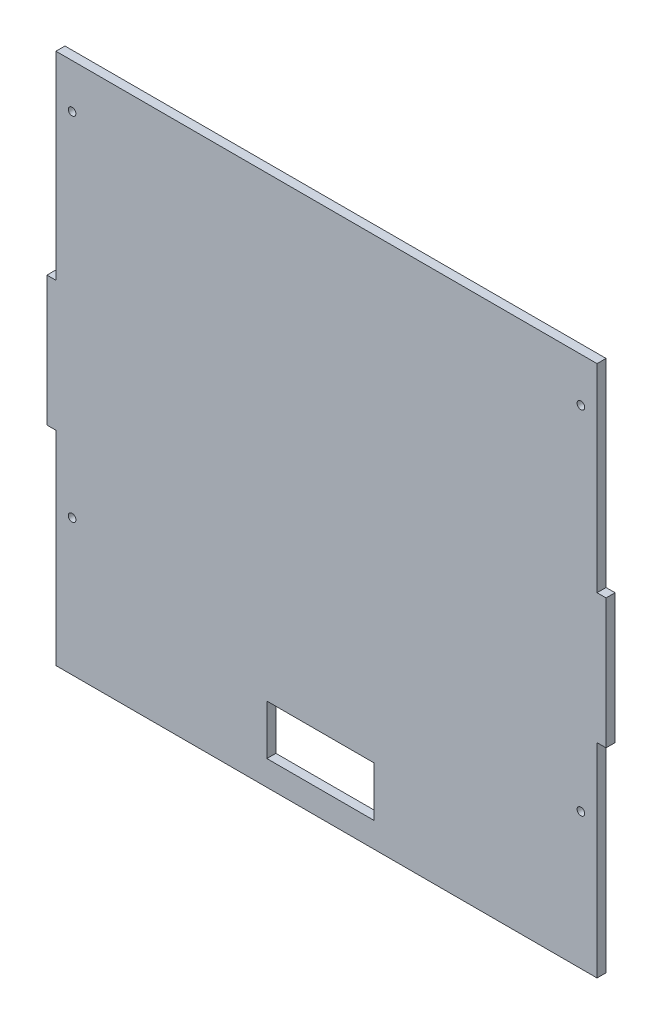
ISO-10303-21;
HEADER;
FILE_DESCRIPTION(('STEP AP214'),'2;1');
FILE_NAME('part.step','',(''),(''),'','','');
FILE_SCHEMA(('AUTOMOTIVE_DESIGN { 1 0 10303 214 1 1 1 1 }'));
ENDSEC;
DATA;
#1=APPLICATION_CONTEXT('core data for automotive mechanical design processes');
#2=APPLICATION_PROTOCOL_DEFINITION('international standard','automotive_design',2000,#1);
#3=PRODUCT_CONTEXT('',#1,'mechanical');
#4=PRODUCT('Part','Part','',(#3));
#5=PRODUCT_RELATED_PRODUCT_CATEGORY('part','',(#4));
#6=PRODUCT_DEFINITION_FORMATION('','',#4);
#7=PRODUCT_DEFINITION_CONTEXT('part definition',#1,'design');
#8=PRODUCT_DEFINITION('design','',#6,#7);
#9=PRODUCT_DEFINITION_SHAPE('','',#8);
#10=(LENGTH_UNIT() NAMED_UNIT(*) SI_UNIT(.MILLI.,.METRE.));
#11=(NAMED_UNIT(*) PLANE_ANGLE_UNIT() SI_UNIT($,.RADIAN.));
#12=(NAMED_UNIT(*) SI_UNIT($,.STERADIAN.) SOLID_ANGLE_UNIT());
#13=UNCERTAINTY_MEASURE_WITH_UNIT(LENGTH_MEASURE(1.E-05),#10,'distance_accuracy_value','');
#14=(GEOMETRIC_REPRESENTATION_CONTEXT(3) GLOBAL_UNCERTAINTY_ASSIGNED_CONTEXT((#13)) GLOBAL_UNIT_ASSIGNED_CONTEXT((#10,
#11,#12)) REPRESENTATION_CONTEXT('',''));
#15=CARTESIAN_POINT('',(0.,0.,0.));
#16=DIRECTION('',(0.,0.,1.));
#17=DIRECTION('',(1.,0.,0.));
#18=AXIS2_PLACEMENT_3D('',#15,#16,#17);
#19=CARTESIAN_POINT('',(-300.,0.,5.));
#20=DIRECTION('',(1.,0.,0.));
#21=DIRECTION('',(0.,0.,-1.));
#22=AXIS2_PLACEMENT_3D('',#19,#20,#21);
#23=PLANE('',#22);
#24=DIRECTION('',(0.,-1.,0.));
#25=VECTOR('',#24,1.);
#26=CARTESIAN_POINT('',(-300.,0.,0.));
#27=LINE('',#26,#25);
#28=CARTESIAN_POINT('',(-300.,0.,0.));
#29=VERTEX_POINT('',#28);
#30=CARTESIAN_POINT('',(-300.,-110.,0.));
#31=VERTEX_POINT('',#30);
#32=EDGE_CURVE('E330',#29,#31,#27,.T.);
#33=ORIENTED_EDGE('',*,*,#32,.T.);
#34=CARTESIAN_POINT('',(-300.,-110.,0.));
#35=CARTESIAN_POINT('',(-300.,-110.,5.));
#36=B_SPLINE_CURVE_WITH_KNOTS('',1,(#34,#35),.UNSPECIFIED.,.F.,.F.,(2,2),(0.,
0.0324675324675325),.UNSPECIFIED.);
#37=CARTESIAN_POINT('',(-300.,-110.,5.));
#38=VERTEX_POINT('',#37);
#39=EDGE_CURVE('E239',#31,#38,#36,.T.);
#40=ORIENTED_EDGE('',*,*,#39,.T.);
#41=DIRECTION('',(0.,-1.,0.));
#42=VECTOR('',#41,1.);
#43=CARTESIAN_POINT('',(-300.,0.,5.));
#44=LINE('',#43,#42);
#45=CARTESIAN_POINT('',(-300.,0.,5.));
#46=VERTEX_POINT('',#45);
#47=EDGE_CURVE('E319',#46,#38,#44,.T.);
#48=ORIENTED_EDGE('',*,*,#47,.F.);
#49=DIRECTION('',(0.,0.,-1.));
#50=VECTOR('',#49,1.);
#51=CARTESIAN_POINT('',(-300.,0.,5.));
#52=LINE('',#51,#50);
#53=EDGE_CURVE('E97',#46,#29,#52,.T.);
#54=ORIENTED_EDGE('',*,*,#53,.T.);
#55=EDGE_LOOP('',(#33,#40,#48,#54));
#56=FACE_BOUND('',#55,.T.);
#57=ADVANCED_FACE('F89',(#56),#23,.F.);
#58=CARTESIAN_POINT('',(0.,0.,5.));
#59=DIRECTION('',(-1.,0.,0.));
#60=DIRECTION('',(0.,-1.,0.));
#61=AXIS2_PLACEMENT_3D('',#58,#59,#60);
#62=PLANE('',#61);
#63=CARTESIAN_POINT('',(0.,-110.,0.));
#64=CARTESIAN_POINT('',(0.,-110.,5.));
#65=B_SPLINE_CURVE_WITH_KNOTS('',1,(#63,#64),.UNSPECIFIED.,.F.,.F.,(2,2),(0.,
0.0324675324675325),.UNSPECIFIED.);
#66=CARTESIAN_POINT('',(0.,-110.,0.));
#67=VERTEX_POINT('',#66);
#68=CARTESIAN_POINT('',(0.,-110.,5.));
#69=VERTEX_POINT('',#68);
#70=EDGE_CURVE('E279',#67,#69,#65,.T.);
#71=ORIENTED_EDGE('',*,*,#70,.F.);
#72=DIRECTION('',(0.,1.,0.));
#73=VECTOR('',#72,1.);
#74=CARTESIAN_POINT('',(0.,0.,0.));
#75=LINE('',#74,#73);
#76=CARTESIAN_POINT('',(0.,0.,0.));
#77=VERTEX_POINT('',#76);
#78=EDGE_CURVE('E294',#67,#77,#75,.T.);
#79=ORIENTED_EDGE('',*,*,#78,.T.);
#80=DIRECTION('',(0.,0.,-1.));
#81=VECTOR('',#80,1.);
#82=CARTESIAN_POINT('',(0.,0.,5.));
#83=LINE('',#82,#81);
#84=CARTESIAN_POINT('',(0.,0.,5.));
#85=VERTEX_POINT('',#84);
#86=EDGE_CURVE('E13',#85,#77,#83,.T.);
#87=ORIENTED_EDGE('',*,*,#86,.F.);
#88=DIRECTION('',(0.,1.,0.));
#89=VECTOR('',#88,1.);
#90=CARTESIAN_POINT('',(0.,0.,5.));
#91=LINE('',#90,#89);
#92=EDGE_CURVE('E316',#69,#85,#91,.T.);
#93=ORIENTED_EDGE('',*,*,#92,.F.);
#94=EDGE_LOOP('',(#71,#79,#87,#93));
#95=FACE_BOUND('',#94,.T.);
#96=ADVANCED_FACE('F91',(#95),#62,.F.);
#97=CARTESIAN_POINT('',(0.,-182.,5.));
#98=CARTESIAN_POINT('',(0.,-182.,0.));
#99=B_SPLINE_CURVE_WITH_KNOTS('',1,(#97,#98),.UNSPECIFIED.,.F.,.F.,(2,2),(0.5,
0.532467532467532),.UNSPECIFIED.);
#100=CARTESIAN_POINT('',(0.,-182.,5.));
#101=VERTEX_POINT('',#100);
#102=CARTESIAN_POINT('',(0.,-182.,0.));
#103=VERTEX_POINT('',#102);
#104=EDGE_CURVE('E272',#101,#103,#99,.T.);
#105=ORIENTED_EDGE('',*,*,#104,.F.);
#106=CARTESIAN_POINT('',(0.,-295.,5.));
#107=VERTEX_POINT('',#106);
#108=EDGE_CURVE('E312',#107,#101,#91,.T.);
#109=ORIENTED_EDGE('',*,*,#108,.F.);
#110=DIRECTION('',(0.,0.,-1.));
#111=VECTOR('',#110,1.);
#112=CARTESIAN_POINT('',(0.,-295.,5.));
#113=LINE('',#112,#111);
#114=CARTESIAN_POINT('',(0.,-295.,0.));
#115=VERTEX_POINT('',#114);
#116=EDGE_CURVE('E324',#107,#115,#113,.T.);
#117=ORIENTED_EDGE('',*,*,#116,.T.);
#118=EDGE_CURVE('E325',#115,#103,#75,.T.);
#119=ORIENTED_EDGE('',*,*,#118,.T.);
#120=EDGE_LOOP('',(#105,#109,#117,#119));
#121=FACE_BOUND('',#120,.T.);
#122=ADVANCED_FACE('F376',(#121),#62,.F.);
#123=CARTESIAN_POINT('',(0.,0.,5.));
#124=DIRECTION('',(0.,-1.,0.));
#125=DIRECTION('',(0.,0.,-1.));
#126=AXIS2_PLACEMENT_3D('',#123,#124,#125);
#127=PLANE('',#126);
#128=DIRECTION('',(-1.,0.,0.));
#129=VECTOR('',#128,1.);
#130=CARTESIAN_POINT('',(0.,0.,0.));
#131=LINE('',#130,#129);
#132=EDGE_CURVE('E327',#77,#29,#131,.T.);
#133=ORIENTED_EDGE('',*,*,#132,.T.);
#134=ORIENTED_EDGE('',*,*,#53,.F.);
#135=DIRECTION('',(-1.,0.,0.));
#136=VECTOR('',#135,1.);
#137=CARTESIAN_POINT('',(0.,0.,5.));
#138=LINE('',#137,#136);
#139=EDGE_CURVE('E315',#85,#46,#138,.T.);
#140=ORIENTED_EDGE('',*,*,#139,.F.);
#141=ORIENTED_EDGE('',*,*,#86,.T.);
#142=EDGE_LOOP('',(#133,#134,#140,#141));
#143=FACE_BOUND('',#142,.T.);
#144=ADVANCED_FACE('F361',(#143),#127,.F.);
#145=CARTESIAN_POINT('',(-300.,-182.,5.));
#146=VERTEX_POINT('',#145);
#147=CARTESIAN_POINT('',(-300.,-295.,5.));
#148=VERTEX_POINT('',#147);
#149=EDGE_CURVE('E318',#146,#148,#44,.T.);
#150=ORIENTED_EDGE('',*,*,#149,.F.);
#151=CARTESIAN_POINT('',(-300.,-182.,5.));
#152=CARTESIAN_POINT('',(-300.,-182.,0.));
#153=B_SPLINE_CURVE_WITH_KNOTS('',1,(#151,#152),.UNSPECIFIED.,.F.,.F.,(2,2),(0.5,
0.532467532467532),.UNSPECIFIED.);
#154=CARTESIAN_POINT('',(-300.,-182.,0.));
#155=VERTEX_POINT('',#154);
#156=EDGE_CURVE('E252',#146,#155,#153,.T.);
#157=ORIENTED_EDGE('',*,*,#156,.T.);
#158=CARTESIAN_POINT('',(-300.,-295.,0.));
#159=VERTEX_POINT('',#158);
#160=EDGE_CURVE('E329',#155,#159,#27,.T.);
#161=ORIENTED_EDGE('',*,*,#160,.T.);
#162=DIRECTION('',(0.,0.,-1.));
#163=VECTOR('',#162,1.);
#164=CARTESIAN_POINT('',(-300.,-295.,5.));
#165=LINE('',#164,#163);
#166=EDGE_CURVE('E337',#148,#159,#165,.T.);
#167=ORIENTED_EDGE('',*,*,#166,.F.);
#168=EDGE_LOOP('',(#150,#157,#161,#167));
#169=FACE_BOUND('',#168,.T.);
#170=ADVANCED_FACE('F385',(#169),#23,.F.);
#171=CARTESIAN_POINT('',(0.,-295.,5.));
#172=DIRECTION('',(0.,1.,0.));
#173=DIRECTION('',(-1.,0.,0.));
#174=AXIS2_PLACEMENT_3D('',#171,#172,#173);
#175=PLANE('',#174);
#176=DIRECTION('',(1.,0.,0.));
#177=VECTOR('',#176,1.);
#178=CARTESIAN_POINT('',(0.,-295.,0.));
#179=LINE('',#178,#177);
#180=EDGE_CURVE('E333',#159,#115,#179,.T.);
#181=ORIENTED_EDGE('',*,*,#180,.T.);
#182=ORIENTED_EDGE('',*,*,#116,.F.);
#183=DIRECTION('',(1.,0.,0.));
#184=VECTOR('',#183,1.);
#185=CARTESIAN_POINT('',(0.,-295.,5.));
#186=LINE('',#185,#184);
#187=EDGE_CURVE('E322',#148,#107,#186,.T.);
#188=ORIENTED_EDGE('',*,*,#187,.F.);
#189=ORIENTED_EDGE('',*,*,#166,.T.);
#190=EDGE_LOOP('',(#181,#182,#188,#189));
#191=FACE_BOUND('',#190,.T.);
#192=ADVANCED_FACE('F382',(#191),#175,.F.);
#193=CARTESIAN_POINT('',(0.,0.,5.));
#194=DIRECTION('',(0.,0.,-1.));
#195=DIRECTION('',(-1.,0.,0.));
#196=AXIS2_PLACEMENT_3D('',#193,#194,#195);
#197=PLANE('',#196);
#198=CARTESIAN_POINT('',(-8.94895975051008,-24.5028370437762,5.));
#199=DIRECTION('',(0.,0.,-1.));
#200=DIRECTION('',(1.,0.,0.));
#201=AXIS2_PLACEMENT_3D('',#198,#199,#200);
#202=CIRCLE('',#201,2.09999999999182);
#203=CARTESIAN_POINT('',(-6.84895975051825,-24.5028370437762,5.));
#204=VERTEX_POINT('',#203);
#205=EDGE_CURVE('E566',#204,#204,#202,.T.);
#206=ORIENTED_EDGE('',*,*,#205,.T.);
#207=EDGE_LOOP('',(#206));
#208=FACE_BOUND('',#207,.T.);
#209=CARTESIAN_POINT('',(-291.05104024949,-24.5028370437762,5.));
#210=DIRECTION('',(0.,0.,-1.));
#211=DIRECTION('',(-1.,0.,0.));
#212=AXIS2_PLACEMENT_3D('',#209,#210,#211);
#213=CIRCLE('',#212,2.09999999999182);
#214=CARTESIAN_POINT('',(-293.151040249482,-24.5028370437762,5.));
#215=VERTEX_POINT('',#214);
#216=EDGE_CURVE('E574',#215,#215,#213,.T.);
#217=ORIENTED_EDGE('',*,*,#216,.T.);
#218=EDGE_LOOP('',(#217));
#219=FACE_BOUND('',#218,.T.);
#220=CARTESIAN_POINT('',(-291.051040249489,-219.502837043776,5.));
#221=DIRECTION('',(0.,0.,-1.));
#222=DIRECTION('',(-1.,0.,0.));
#223=AXIS2_PLACEMENT_3D('',#220,#221,#222);
#224=CIRCLE('',#223,2.10000000055005);
#225=CARTESIAN_POINT('',(-293.151040250039,-219.502837043776,5.));
#226=VERTEX_POINT('',#225);
#227=EDGE_CURVE('E580',#226,#226,#224,.T.);
#228=ORIENTED_EDGE('',*,*,#227,.T.);
#229=EDGE_LOOP('',(#228));
#230=FACE_BOUND('',#229,.T.);
#231=CARTESIAN_POINT('',(-8.94895975051069,-219.502837043776,5.));
#232=DIRECTION('',(0.,0.,-1.));
#233=DIRECTION('',(1.,0.,0.));
#234=AXIS2_PLACEMENT_3D('',#231,#232,#233);
#235=CIRCLE('',#234,2.10000000055011);
#236=CARTESIAN_POINT('',(-6.84895974996057,-219.502837043776,5.));
#237=VERTEX_POINT('',#236);
#238=EDGE_CURVE('E586',#237,#237,#235,.T.);
#239=ORIENTED_EDGE('',*,*,#238,.T.);
#240=EDGE_LOOP('',(#239));
#241=FACE_BOUND('',#240,.T.);
#242=DIRECTION('',(1.,0.,0.));
#243=VECTOR('',#242,1.);
#244=CARTESIAN_POINT('',(0.,-253.546669542968,5.));
#245=LINE('',#244,#243);
#246=CARTESIAN_POINT('',(-183.05126017735,-253.546669542968,5.));
#247=VERTEX_POINT('',#246);
#248=CARTESIAN_POINT('',(-123.642665934518,-253.546669542968,5.));
#249=VERTEX_POINT('',#248);
#250=EDGE_CURVE('E233',#247,#249,#245,.T.);
#251=ORIENTED_EDGE('',*,*,#250,.T.);
#252=DIRECTION('',(0.,-1.,0.));
#253=VECTOR('',#252,1.);
#254=CARTESIAN_POINT('',(-123.642665934518,0.,5.));
#255=LINE('',#254,#253);
#256=CARTESIAN_POINT('',(-123.642665934518,-281.159114754425,5.));
#257=VERTEX_POINT('',#256);
#258=EDGE_CURVE('E236',#249,#257,#255,.T.);
#259=ORIENTED_EDGE('',*,*,#258,.T.);
#260=DIRECTION('',(-1.,0.,0.));
#261=VECTOR('',#260,1.);
#262=CARTESIAN_POINT('',(0.,-281.159114754425,5.));
#263=LINE('',#262,#261);
#264=CARTESIAN_POINT('',(-183.05126017735,-281.159114754425,5.));
#265=VERTEX_POINT('',#264);
#266=EDGE_CURVE('E228',#257,#265,#263,.T.);
#267=ORIENTED_EDGE('',*,*,#266,.T.);
#268=DIRECTION('',(0.,1.,0.));
#269=VECTOR('',#268,1.);
#270=CARTESIAN_POINT('',(-183.05126017735,0.,5.));
#271=LINE('',#270,#269);
#272=EDGE_CURVE('E208',#265,#247,#271,.T.);
#273=ORIENTED_EDGE('',*,*,#272,.T.);
#274=EDGE_LOOP('',(#251,#259,#267,#273));
#275=FACE_BOUND('',#274,.T.);
#276=ORIENTED_EDGE('',*,*,#108,.T.);
#277=DIRECTION('',(-1.,0.,0.));
#278=VECTOR('',#277,1.);
#279=CARTESIAN_POINT('',(9.99999999954891,-182.,5.));
#280=LINE('',#279,#278);
#281=CARTESIAN_POINT('',(4.99999999999999,-182.,5.));
#282=VERTEX_POINT('',#281);
#283=EDGE_CURVE('E278',#282,#101,#280,.T.);
#284=ORIENTED_EDGE('',*,*,#283,.F.);
#285=DIRECTION('',(0.,-1.,0.));
#286=VECTOR('',#285,1.);
#287=CARTESIAN_POINT('',(4.99999999999998,-110.,5.));
#288=LINE('',#287,#286);
#289=CARTESIAN_POINT('',(4.99999999999998,-110.,5.));
#290=VERTEX_POINT('',#289);
#291=EDGE_CURVE('E295',#290,#282,#288,.T.);
#292=ORIENTED_EDGE('',*,*,#291,.F.);
#293=DIRECTION('',(-1.,0.,0.));
#294=VECTOR('',#293,1.);
#295=CARTESIAN_POINT('',(9.99999999954891,-110.,5.));
#296=LINE('',#295,#294);
#297=EDGE_CURVE('E287',#290,#69,#296,.T.);
#298=ORIENTED_EDGE('',*,*,#297,.T.);
#299=ORIENTED_EDGE('',*,*,#92,.T.);
#300=ORIENTED_EDGE('',*,*,#139,.T.);
#301=ORIENTED_EDGE('',*,*,#47,.T.);
#302=DIRECTION('',(1.,0.,0.));
#303=VECTOR('',#302,1.);
#304=CARTESIAN_POINT('',(-310.000000000001,-110.,5.));
#305=LINE('',#304,#303);
#306=CARTESIAN_POINT('',(-305.000000000001,-110.,5.));
#307=VERTEX_POINT('',#306);
#308=EDGE_CURVE('E260',#307,#38,#305,.T.);
#309=ORIENTED_EDGE('',*,*,#308,.F.);
#310=DIRECTION('',(0.,1.,0.));
#311=VECTOR('',#310,1.);
#312=CARTESIAN_POINT('',(-305.000000000001,-110.,5.));
#313=LINE('',#312,#311);
#314=CARTESIAN_POINT('',(-305.000000000001,-182.,5.));
#315=VERTEX_POINT('',#314);
#316=EDGE_CURVE('E247',#315,#307,#313,.T.);
#317=ORIENTED_EDGE('',*,*,#316,.F.);
#318=DIRECTION('',(1.,0.,0.));
#319=VECTOR('',#318,1.);
#320=CARTESIAN_POINT('',(-310.000000000001,-182.,5.));
#321=LINE('',#320,#319);
#322=EDGE_CURVE('E267',#315,#146,#321,.T.);
#323=ORIENTED_EDGE('',*,*,#322,.T.);
#324=ORIENTED_EDGE('',*,*,#149,.T.);
#325=ORIENTED_EDGE('',*,*,#187,.T.);
#326=EDGE_LOOP('',(#276,#284,#292,#298,#299,#300,#301,#309,#317,#323,#324,#325));
#327=FACE_BOUND('',#326,.T.);
#328=ADVANCED_FACE('F358',(#208,#219,#230,#241,#275,#327),#197,.F.);
#329=CARTESIAN_POINT('',(0.,0.,0.));
#330=DIRECTION('',(0.,0.,-1.));
#331=DIRECTION('',(-1.,0.,0.));
#332=AXIS2_PLACEMENT_3D('',#329,#330,#331);
#333=PLANE('',#332);
#334=CARTESIAN_POINT('',(-8.94895975051008,-24.5028370437762,0.));
#335=DIRECTION('',(0.,0.,-1.));
#336=DIRECTION('',(1.,0.,0.));
#337=AXIS2_PLACEMENT_3D('',#334,#335,#336);
#338=CIRCLE('',#337,2.09999999999182);
#339=CARTESIAN_POINT('',(-6.84895975051825,-24.5028370437762,0.));
#340=VERTEX_POINT('',#339);
#341=EDGE_CURVE('E569',#340,#340,#338,.T.);
#342=ORIENTED_EDGE('',*,*,#341,.F.);
#343=EDGE_LOOP('',(#342));
#344=FACE_BOUND('',#343,.T.);
#345=CARTESIAN_POINT('',(-291.05104024949,-24.5028370437762,0.));
#346=DIRECTION('',(0.,0.,-1.));
#347=DIRECTION('',(-1.,0.,0.));
#348=AXIS2_PLACEMENT_3D('',#345,#346,#347);
#349=CIRCLE('',#348,2.09999999999182);
#350=CARTESIAN_POINT('',(-293.151040249482,-24.5028370437762,0.));
#351=VERTEX_POINT('',#350);
#352=EDGE_CURVE('E571',#351,#351,#349,.T.);
#353=ORIENTED_EDGE('',*,*,#352,.F.);
#354=EDGE_LOOP('',(#353));
#355=FACE_BOUND('',#354,.T.);
#356=CARTESIAN_POINT('',(-291.051040249489,-219.502837043776,0.));
#357=DIRECTION('',(0.,0.,-1.));
#358=DIRECTION('',(-1.,0.,0.));
#359=AXIS2_PLACEMENT_3D('',#356,#357,#358);
#360=CIRCLE('',#359,2.10000000055005);
#361=CARTESIAN_POINT('',(-293.151040250039,-219.502837043776,0.));
#362=VERTEX_POINT('',#361);
#363=EDGE_CURVE('E583',#362,#362,#360,.T.);
#364=ORIENTED_EDGE('',*,*,#363,.F.);
#365=EDGE_LOOP('',(#364));
#366=FACE_BOUND('',#365,.T.);
#367=CARTESIAN_POINT('',(-8.94895975051069,-219.502837043776,0.));
#368=DIRECTION('',(0.,0.,-1.));
#369=DIRECTION('',(1.,0.,0.));
#370=AXIS2_PLACEMENT_3D('',#367,#368,#369);
#371=CIRCLE('',#370,2.10000000055011);
#372=CARTESIAN_POINT('',(-6.84895974996057,-219.502837043776,0.));
#373=VERTEX_POINT('',#372);
#374=EDGE_CURVE('E577',#373,#373,#371,.T.);
#375=ORIENTED_EDGE('',*,*,#374,.F.);
#376=EDGE_LOOP('',(#375));
#377=FACE_BOUND('',#376,.T.);
#378=DIRECTION('',(0.,-1.,0.));
#379=VECTOR('',#378,1.);
#380=CARTESIAN_POINT('',(-123.642665934518,-281.159114754425,0.));
#381=LINE('',#380,#379);
#382=CARTESIAN_POINT('',(-123.642665934518,-253.546669542968,0.));
#383=VERTEX_POINT('',#382);
#384=CARTESIAN_POINT('',(-123.642665934518,-281.159114754425,0.));
#385=VERTEX_POINT('',#384);
#386=EDGE_CURVE('E112',#383,#385,#381,.T.);
#387=ORIENTED_EDGE('',*,*,#386,.F.);
#388=DIRECTION('',(1.,0.,0.));
#389=VECTOR('',#388,1.);
#390=CARTESIAN_POINT('',(-123.642665934518,-253.546669542968,0.));
#391=LINE('',#390,#389);
#392=CARTESIAN_POINT('',(-183.05126017735,-253.546669542968,0.));
#393=VERTEX_POINT('',#392);
#394=EDGE_CURVE('E221',#393,#383,#391,.T.);
#395=ORIENTED_EDGE('',*,*,#394,.F.);
#396=DIRECTION('',(0.,1.,0.));
#397=VECTOR('',#396,1.);
#398=CARTESIAN_POINT('',(-183.05126017735,-281.159114754425,0.));
#399=LINE('',#398,#397);
#400=CARTESIAN_POINT('',(-183.05126017735,-281.159114754425,0.));
#401=VERTEX_POINT('',#400);
#402=EDGE_CURVE('E205',#401,#393,#399,.T.);
#403=ORIENTED_EDGE('',*,*,#402,.F.);
#404=DIRECTION('',(-1.,0.,0.));
#405=VECTOR('',#404,1.);
#406=CARTESIAN_POINT('',(-123.642665934518,-281.159114754425,0.));
#407=LINE('',#406,#405);
#408=EDGE_CURVE('E214',#385,#401,#407,.T.);
#409=ORIENTED_EDGE('',*,*,#408,.F.);
#410=EDGE_LOOP('',(#387,#395,#403,#409));
#411=FACE_BOUND('',#410,.T.);
#412=ORIENTED_EDGE('',*,*,#118,.F.);
#413=ORIENTED_EDGE('',*,*,#180,.F.);
#414=ORIENTED_EDGE('',*,*,#160,.F.);
#415=DIRECTION('',(1.,0.,0.));
#416=VECTOR('',#415,1.);
#417=CARTESIAN_POINT('',(-310.000000000001,-182.,0.));
#418=LINE('',#417,#416);
#419=CARTESIAN_POINT('',(-305.000000000001,-182.,0.));
#420=VERTEX_POINT('',#419);
#421=EDGE_CURVE('E265',#420,#155,#418,.T.);
#422=ORIENTED_EDGE('',*,*,#421,.F.);
#423=DIRECTION('',(0.,-1.,0.));
#424=VECTOR('',#423,1.);
#425=CARTESIAN_POINT('',(-305.000000000001,-182.,0.));
#426=LINE('',#425,#424);
#427=CARTESIAN_POINT('',(-305.000000000001,-110.,0.));
#428=VERTEX_POINT('',#427);
#429=EDGE_CURVE('E242',#428,#420,#426,.T.);
#430=ORIENTED_EDGE('',*,*,#429,.F.);
#431=DIRECTION('',(1.,0.,0.));
#432=VECTOR('',#431,1.);
#433=CARTESIAN_POINT('',(-310.000000000001,-110.,0.));
#434=LINE('',#433,#432);
#435=EDGE_CURVE('E243',#428,#31,#434,.T.);
#436=ORIENTED_EDGE('',*,*,#435,.T.);
#437=ORIENTED_EDGE('',*,*,#32,.F.);
#438=ORIENTED_EDGE('',*,*,#132,.F.);
#439=ORIENTED_EDGE('',*,*,#78,.F.);
#440=DIRECTION('',(-1.,0.,0.));
#441=VECTOR('',#440,1.);
#442=CARTESIAN_POINT('',(9.99999999954891,-110.,0.));
#443=LINE('',#442,#441);
#444=CARTESIAN_POINT('',(5.,-110.,0.));
#445=VERTEX_POINT('',#444);
#446=EDGE_CURVE('E271',#445,#67,#443,.T.);
#447=ORIENTED_EDGE('',*,*,#446,.F.);
#448=DIRECTION('',(0.,1.,0.));
#449=VECTOR('',#448,1.);
#450=CARTESIAN_POINT('',(5.,-182.,0.));
#451=LINE('',#450,#449);
#452=CARTESIAN_POINT('',(5.,-182.,0.));
#453=VERTEX_POINT('',#452);
#454=EDGE_CURVE('E301',#453,#445,#451,.T.);
#455=ORIENTED_EDGE('',*,*,#454,.F.);
#456=DIRECTION('',(-1.,0.,0.));
#457=VECTOR('',#456,1.);
#458=CARTESIAN_POINT('',(9.99999999954891,-182.,0.));
#459=LINE('',#458,#457);
#460=EDGE_CURVE('E277',#453,#103,#459,.T.);
#461=ORIENTED_EDGE('',*,*,#460,.T.);
#462=EDGE_LOOP('',(#412,#413,#414,#422,#430,#436,#437,#438,#439,#447,#455,#461));
#463=FACE_BOUND('',#462,.T.);
#464=ADVANCED_FACE('F218',(#344,#355,#366,#377,#411,#463),#333,.T.);
#465=CARTESIAN_POINT('',(9.99999999954891,-110.,0.));
#466=DIRECTION('',(0.,-1.,0.));
#467=DIRECTION('',(1.,0.,0.));
#468=AXIS2_PLACEMENT_3D('',#465,#466,#467);
#469=PLANE('',#468);
#470=DIRECTION('',(0.,0.,1.));
#471=VECTOR('',#470,1.);
#472=CARTESIAN_POINT('',(5.,-110.,0.));
#473=LINE('',#472,#471);
#474=EDGE_CURVE('E298',#445,#290,#473,.T.);
#475=ORIENTED_EDGE('',*,*,#474,.F.);
#476=ORIENTED_EDGE('',*,*,#446,.T.);
#477=ORIENTED_EDGE('',*,*,#70,.T.);
#478=ORIENTED_EDGE('',*,*,#297,.F.);
#479=EDGE_LOOP('',(#475,#476,#477,#478));
#480=FACE_BOUND('',#479,.T.);
#481=ADVANCED_FACE('F366',(#480),#469,.F.);
#482=CARTESIAN_POINT('',(9.99999999954891,-182.,5.));
#483=DIRECTION('',(0.,1.,0.));
#484=DIRECTION('',(-1.,0.,0.));
#485=AXIS2_PLACEMENT_3D('',#482,#483,#484);
#486=PLANE('',#485);
#487=DIRECTION('',(0.,0.,-1.));
#488=VECTOR('',#487,1.);
#489=CARTESIAN_POINT('',(4.99999999999998,-182.,4.99999999999998));
#490=LINE('',#489,#488);
#491=EDGE_CURVE('E288',#282,#453,#490,.T.);
#492=ORIENTED_EDGE('',*,*,#491,.F.);
#493=ORIENTED_EDGE('',*,*,#283,.T.);
#494=ORIENTED_EDGE('',*,*,#104,.T.);
#495=ORIENTED_EDGE('',*,*,#460,.F.);
#496=EDGE_LOOP('',(#492,#493,#494,#495));
#497=FACE_BOUND('',#496,.T.);
#498=ADVANCED_FACE('F372',(#497),#486,.F.);
#499=CARTESIAN_POINT('',(5.,0.,0.));
#500=DIRECTION('',(1.,0.,0.));
#501=DIRECTION('',(0.,0.,-1.));
#502=AXIS2_PLACEMENT_3D('',#499,#500,#501);
#503=PLANE('',#502);
#504=ORIENTED_EDGE('',*,*,#454,.T.);
#505=ORIENTED_EDGE('',*,*,#474,.T.);
#506=ORIENTED_EDGE('',*,*,#291,.T.);
#507=ORIENTED_EDGE('',*,*,#491,.T.);
#508=EDGE_LOOP('',(#504,#505,#506,#507));
#509=FACE_BOUND('',#508,.T.);
#510=ADVANCED_FACE('F369',(#509),#503,.T.);
#511=CARTESIAN_POINT('',(-310.000000000001,-110.,0.));
#512=DIRECTION('',(0.,1.,0.));
#513=DIRECTION('',(0.,0.,1.));
#514=AXIS2_PLACEMENT_3D('',#511,#512,#513);
#515=PLANE('',#514);
#516=DIRECTION('',(0.,0.,-1.));
#517=VECTOR('',#516,1.);
#518=CARTESIAN_POINT('',(-305.000000000001,-110.,0.));
#519=LINE('',#518,#517);
#520=EDGE_CURVE('E245',#307,#428,#519,.T.);
#521=ORIENTED_EDGE('',*,*,#520,.F.);
#522=ORIENTED_EDGE('',*,*,#308,.T.);
#523=ORIENTED_EDGE('',*,*,#39,.F.);
#524=ORIENTED_EDGE('',*,*,#435,.F.);
#525=EDGE_LOOP('',(#521,#522,#523,#524));
#526=FACE_BOUND('',#525,.T.);
#527=ADVANCED_FACE('F355',(#526),#515,.T.);
#528=CARTESIAN_POINT('',(-310.000000000001,-182.,5.));
#529=DIRECTION('',(0.,-1.,0.));
#530=DIRECTION('',(0.,0.,-1.));
#531=AXIS2_PLACEMENT_3D('',#528,#529,#530);
#532=PLANE('',#531);
#533=DIRECTION('',(0.,0.,1.));
#534=VECTOR('',#533,1.);
#535=CARTESIAN_POINT('',(-305.000000000001,-182.,4.99999999999998));
#536=LINE('',#535,#534);
#537=EDGE_CURVE('E240',#420,#315,#536,.T.);
#538=ORIENTED_EDGE('',*,*,#537,.F.);
#539=ORIENTED_EDGE('',*,*,#421,.T.);
#540=ORIENTED_EDGE('',*,*,#156,.F.);
#541=ORIENTED_EDGE('',*,*,#322,.F.);
#542=EDGE_LOOP('',(#538,#539,#540,#541));
#543=FACE_BOUND('',#542,.T.);
#544=ADVANCED_FACE('F390',(#543),#532,.T.);
#545=CARTESIAN_POINT('',(-305.000000000001,-3.99680288865056E-12,3.99680288865056E-12));
#546=DIRECTION('',(1.,0.,0.));
#547=DIRECTION('',(0.,0.,-1.));
#548=AXIS2_PLACEMENT_3D('',#545,#546,#547);
#549=PLANE('',#548);
#550=ORIENTED_EDGE('',*,*,#520,.T.);
#551=ORIENTED_EDGE('',*,*,#429,.T.);
#552=ORIENTED_EDGE('',*,*,#537,.T.);
#553=ORIENTED_EDGE('',*,*,#316,.T.);
#554=EDGE_LOOP('',(#550,#551,#552,#553));
#555=FACE_BOUND('',#554,.T.);
#556=ADVANCED_FACE('F392',(#555),#549,.F.);
#557=CARTESIAN_POINT('',(-123.642665934518,-281.159114754425,10.));
#558=DIRECTION('',(1.,0.,0.));
#559=DIRECTION('',(0.,0.,-1.));
#560=AXIS2_PLACEMENT_3D('',#557,#558,#559);
#561=PLANE('',#560);
#562=DIRECTION('',(0.,0.,-1.));
#563=VECTOR('',#562,1.);
#564=CARTESIAN_POINT('',(-123.642665934518,-253.546669542968,10.));
#565=LINE('',#564,#563);
#566=EDGE_CURVE('E226',#249,#383,#565,.T.);
#567=ORIENTED_EDGE('',*,*,#566,.T.);
#568=ORIENTED_EDGE('',*,*,#386,.T.);
#569=DIRECTION('',(0.,0.,-1.));
#570=VECTOR('',#569,1.);
#571=CARTESIAN_POINT('',(-123.642665934518,-281.159114754425,10.));
#572=LINE('',#571,#570);
#573=EDGE_CURVE('E211',#257,#385,#572,.T.);
#574=ORIENTED_EDGE('',*,*,#573,.F.);
#575=ORIENTED_EDGE('',*,*,#258,.F.);
#576=EDGE_LOOP('',(#567,#568,#574,#575));
#577=FACE_BOUND('',#576,.T.);
#578=ADVANCED_FACE('F394',(#577),#561,.F.);
#579=CARTESIAN_POINT('',(-123.642665934518,-253.546669542968,10.));
#580=DIRECTION('',(0.,1.,0.));
#581=DIRECTION('',(0.,0.,1.));
#582=AXIS2_PLACEMENT_3D('',#579,#580,#581);
#583=PLANE('',#582);
#584=DIRECTION('',(0.,0.,-1.));
#585=VECTOR('',#584,1.);
#586=CARTESIAN_POINT('',(-183.05126017735,-253.546669542968,10.));
#587=LINE('',#586,#585);
#588=EDGE_CURVE('E210',#247,#393,#587,.T.);
#589=ORIENTED_EDGE('',*,*,#588,.T.);
#590=ORIENTED_EDGE('',*,*,#394,.T.);
#591=ORIENTED_EDGE('',*,*,#566,.F.);
#592=ORIENTED_EDGE('',*,*,#250,.F.);
#593=EDGE_LOOP('',(#589,#590,#591,#592));
#594=FACE_BOUND('',#593,.T.);
#595=ADVANCED_FACE('F400',(#594),#583,.F.);
#596=CARTESIAN_POINT('',(-183.05126017735,-281.159114754425,10.));
#597=DIRECTION('',(-1.,0.,0.));
#598=DIRECTION('',(0.,0.,1.));
#599=AXIS2_PLACEMENT_3D('',#596,#597,#598);
#600=PLANE('',#599);
#601=DIRECTION('',(0.,0.,-1.));
#602=VECTOR('',#601,1.);
#603=CARTESIAN_POINT('',(-183.05126017735,-281.159114754425,10.));
#604=LINE('',#603,#602);
#605=EDGE_CURVE('E104',#265,#401,#604,.T.);
#606=ORIENTED_EDGE('',*,*,#605,.T.);
#607=ORIENTED_EDGE('',*,*,#402,.T.);
#608=ORIENTED_EDGE('',*,*,#588,.F.);
#609=ORIENTED_EDGE('',*,*,#272,.F.);
#610=EDGE_LOOP('',(#606,#607,#608,#609));
#611=FACE_BOUND('',#610,.T.);
#612=ADVANCED_FACE('F202',(#611),#600,.F.);
#613=CARTESIAN_POINT('',(-123.642665934518,-281.159114754425,10.));
#614=DIRECTION('',(0.,-1.,0.));
#615=DIRECTION('',(0.,0.,-1.));
#616=AXIS2_PLACEMENT_3D('',#613,#614,#615);
#617=PLANE('',#616);
#618=ORIENTED_EDGE('',*,*,#573,.T.);
#619=ORIENTED_EDGE('',*,*,#408,.T.);
#620=ORIENTED_EDGE('',*,*,#605,.F.);
#621=ORIENTED_EDGE('',*,*,#266,.F.);
#622=EDGE_LOOP('',(#618,#619,#620,#621));
#623=FACE_BOUND('',#622,.T.);
#624=ADVANCED_FACE('F215',(#623),#617,.F.);
#625=CARTESIAN_POINT('',(-8.94895975051069,-219.502837043776,5.));
#626=DIRECTION('',(0.,0.,-1.));
#627=DIRECTION('',(-1.,0.,0.));
#628=AXIS2_PLACEMENT_3D('',#625,#626,#627);
#629=CYLINDRICAL_SURFACE('',#628,2.10000000055011);
#630=ORIENTED_EDGE('',*,*,#238,.F.);
#631=EDGE_LOOP('',(#630));
#632=FACE_BOUND('',#631,.T.);
#633=ORIENTED_EDGE('',*,*,#374,.T.);
#634=EDGE_LOOP('',(#633));
#635=FACE_BOUND('',#634,.T.);
#636=ADVANCED_FACE('F501',(#632,#635),#629,.F.);
#637=CARTESIAN_POINT('',(-291.051040249489,-219.502837043776,5.));
#638=DIRECTION('',(0.,0.,-1.));
#639=DIRECTION('',(-1.,0.,0.));
#640=AXIS2_PLACEMENT_3D('',#637,#638,#639);
#641=CYLINDRICAL_SURFACE('',#640,2.10000000055005);
#642=ORIENTED_EDGE('',*,*,#227,.F.);
#643=EDGE_LOOP('',(#642));
#644=FACE_BOUND('',#643,.T.);
#645=ORIENTED_EDGE('',*,*,#363,.T.);
#646=EDGE_LOOP('',(#645));
#647=FACE_BOUND('',#646,.T.);
#648=ADVANCED_FACE('F510',(#644,#647),#641,.F.);
#649=CARTESIAN_POINT('',(-291.05104024949,-24.5028370437762,5.));
#650=DIRECTION('',(0.,0.,-1.));
#651=DIRECTION('',(-1.,0.,0.));
#652=AXIS2_PLACEMENT_3D('',#649,#650,#651);
#653=CYLINDRICAL_SURFACE('',#652,2.09999999999182);
#654=ORIENTED_EDGE('',*,*,#216,.F.);
#655=EDGE_LOOP('',(#654));
#656=FACE_BOUND('',#655,.T.);
#657=ORIENTED_EDGE('',*,*,#352,.T.);
#658=EDGE_LOOP('',(#657));
#659=FACE_BOUND('',#658,.T.);
#660=ADVANCED_FACE('F520',(#656,#659),#653,.F.);
#661=CARTESIAN_POINT('',(-8.94895975051008,-24.5028370437762,5.));
#662=DIRECTION('',(0.,0.,-1.));
#663=DIRECTION('',(-1.,0.,0.));
#664=AXIS2_PLACEMENT_3D('',#661,#662,#663);
#665=CYLINDRICAL_SURFACE('',#664,2.09999999999182);
#666=ORIENTED_EDGE('',*,*,#205,.F.);
#667=EDGE_LOOP('',(#666));
#668=FACE_BOUND('',#667,.T.);
#669=ORIENTED_EDGE('',*,*,#341,.T.);
#670=EDGE_LOOP('',(#669));
#671=FACE_BOUND('',#670,.T.);
#672=ADVANCED_FACE('F530',(#668,#671),#665,.F.);
#673=CLOSED_SHELL('',(#57,#96,#122,#144,#170,#192,#328,#464,#481,#498,#510,#527,#544,#556,#578,
#595,#612,#624,#636,#648,#660,#672));
#674=MANIFOLD_SOLID_BREP('B2',#673);
#675=ADVANCED_BREP_SHAPE_REPRESENTATION('',(#18,#674),#14);
#676=SHAPE_DEFINITION_REPRESENTATION(#9,#675);
ENDSEC;
END-ISO-10303-21;
